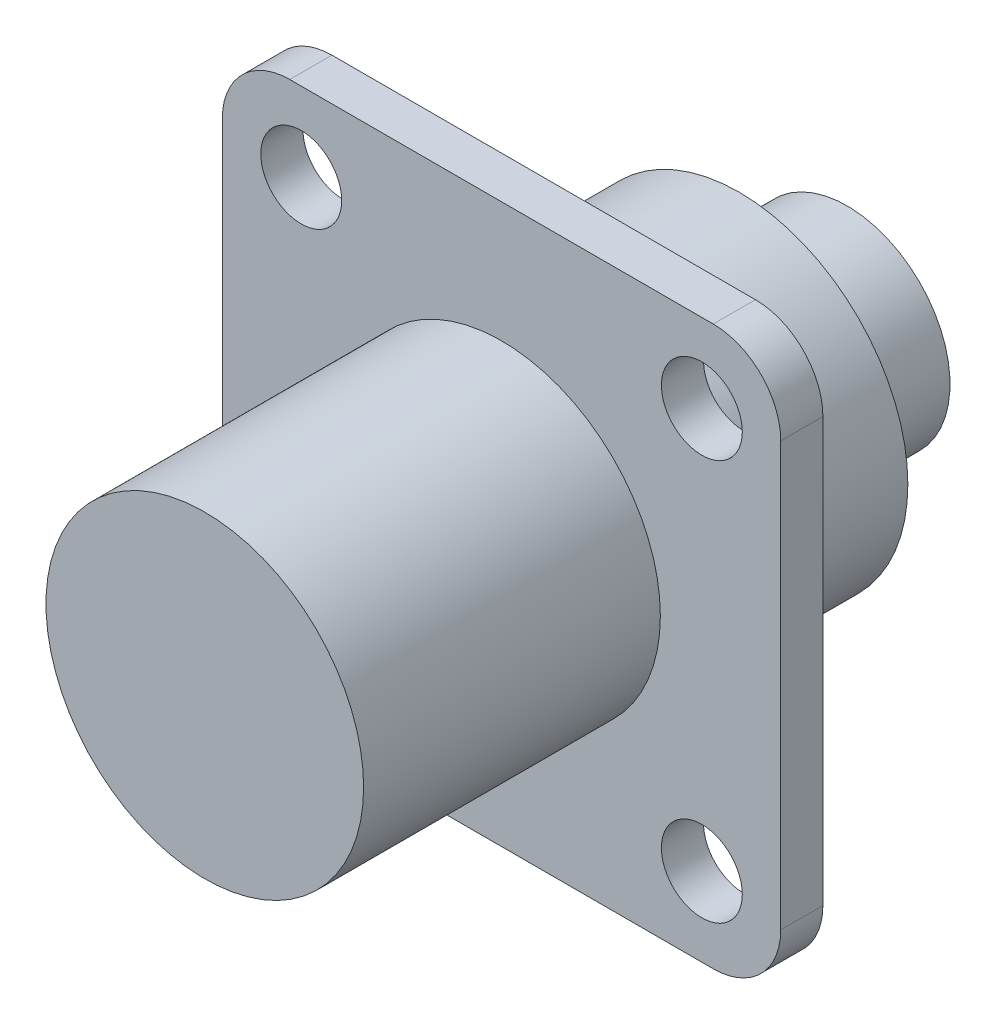
ISO-10303-21;
HEADER;
FILE_DESCRIPTION(('STEP AP214'),'2;1');
FILE_NAME('part.step','',(''),(''),'','','');
FILE_SCHEMA(('AUTOMOTIVE_DESIGN { 1 0 10303 214 1 1 1 1 }'));
ENDSEC;
DATA;
#1=APPLICATION_CONTEXT('core data for automotive mechanical design processes');
#2=APPLICATION_PROTOCOL_DEFINITION('international standard','automotive_design',2000,#1);
#3=PRODUCT_CONTEXT('',#1,'mechanical');
#4=PRODUCT('Part','Part','',(#3));
#5=PRODUCT_RELATED_PRODUCT_CATEGORY('part','',(#4));
#6=PRODUCT_DEFINITION_FORMATION('','',#4);
#7=PRODUCT_DEFINITION_CONTEXT('part definition',#1,'design');
#8=PRODUCT_DEFINITION('design','',#6,#7);
#9=PRODUCT_DEFINITION_SHAPE('','',#8);
#10=(LENGTH_UNIT() NAMED_UNIT(*) SI_UNIT(.MILLI.,.METRE.));
#11=(NAMED_UNIT(*) PLANE_ANGLE_UNIT() SI_UNIT($,.RADIAN.));
#12=(NAMED_UNIT(*) SI_UNIT($,.STERADIAN.) SOLID_ANGLE_UNIT());
#13=UNCERTAINTY_MEASURE_WITH_UNIT(LENGTH_MEASURE(1.E-05),#10,'distance_accuracy_value','');
#14=(GEOMETRIC_REPRESENTATION_CONTEXT(3) GLOBAL_UNCERTAINTY_ASSIGNED_CONTEXT((#13)) GLOBAL_UNIT_ASSIGNED_CONTEXT((#10,
#11,#12)) REPRESENTATION_CONTEXT('',''));
#15=CARTESIAN_POINT('',(0.,0.,0.));
#16=DIRECTION('',(0.,0.,1.));
#17=DIRECTION('',(1.,0.,0.));
#18=AXIS2_PLACEMENT_3D('',#15,#16,#17);
#19=CARTESIAN_POINT('',(10.5156,10.5156,1.5875));
#20=DIRECTION('',(-1.,0.,0.));
#21=DIRECTION('',(0.,-1.,0.));
#22=AXIS2_PLACEMENT_3D('',#19,#20,#21);
#23=PLANE('',#22);
#24=DIRECTION('',(0.,1.,0.));
#25=VECTOR('',#24,1.);
#26=CARTESIAN_POINT('',(10.5156,10.5156,0.));
#27=LINE('',#26,#25);
#28=CARTESIAN_POINT('',(10.5156,-7.9756,0.));
#29=VERTEX_POINT('',#28);
#30=CARTESIAN_POINT('',(10.5156,7.9756,0.));
#31=VERTEX_POINT('',#30);
#32=EDGE_CURVE('E131',#29,#31,#27,.T.);
#33=ORIENTED_EDGE('',*,*,#32,.T.);
#34=DIRECTION('',(0.,0.,-1.));
#35=VECTOR('',#34,1.);
#36=CARTESIAN_POINT('',(10.5156,7.9756,1.5875));
#37=LINE('',#36,#35);
#38=CARTESIAN_POINT('',(10.5156,7.9756,1.5875));
#39=VERTEX_POINT('',#38);
#40=EDGE_CURVE('E109',#31,#39,#37,.F.);
#41=ORIENTED_EDGE('',*,*,#40,.T.);
#42=DIRECTION('',(0.,1.,0.));
#43=VECTOR('',#42,1.);
#44=CARTESIAN_POINT('',(10.5156,10.5156,1.5875));
#45=LINE('',#44,#43);
#46=CARTESIAN_POINT('',(10.5156,-7.9756,1.5875));
#47=VERTEX_POINT('',#46);
#48=EDGE_CURVE('E141',#47,#39,#45,.T.);
#49=ORIENTED_EDGE('',*,*,#48,.F.);
#50=DIRECTION('',(0.,0.,-1.));
#51=VECTOR('',#50,1.);
#52=CARTESIAN_POINT('',(10.5156,-7.9756,1.5875));
#53=LINE('',#52,#51);
#54=EDGE_CURVE('E114',#47,#29,#53,.T.);
#55=ORIENTED_EDGE('',*,*,#54,.T.);
#56=EDGE_LOOP('',(#33,#41,#49,#55));
#57=FACE_BOUND('',#56,.T.);
#58=ADVANCED_FACE('F37',(#57),#23,.F.);
#59=CARTESIAN_POINT('',(-10.5156,10.5156,1.5875));
#60=DIRECTION('',(0.,-1.,0.));
#61=DIRECTION('',(0.,0.,-1.));
#62=AXIS2_PLACEMENT_3D('',#59,#60,#61);
#63=PLANE('',#62);
#64=DIRECTION('',(-1.,0.,0.));
#65=VECTOR('',#64,1.);
#66=CARTESIAN_POINT('',(-10.5156,10.5156,1.5875));
#67=LINE('',#66,#65);
#68=CARTESIAN_POINT('',(7.97559999999999,10.5156,1.5875));
#69=VERTEX_POINT('',#68);
#70=CARTESIAN_POINT('',(-7.9756,10.5156,1.5875));
#71=VERTEX_POINT('',#70);
#72=EDGE_CURVE('E124',#69,#71,#67,.T.);
#73=ORIENTED_EDGE('',*,*,#72,.F.);
#74=DIRECTION('',(0.,0.,-1.));
#75=VECTOR('',#74,1.);
#76=CARTESIAN_POINT('',(7.97559999999999,10.5156,1.5875));
#77=LINE('',#76,#75);
#78=CARTESIAN_POINT('',(7.97559999999999,10.5156,0.));
#79=VERTEX_POINT('',#78);
#80=EDGE_CURVE('E108',#69,#79,#77,.T.);
#81=ORIENTED_EDGE('',*,*,#80,.T.);
#82=DIRECTION('',(-1.,0.,0.));
#83=VECTOR('',#82,1.);
#84=CARTESIAN_POINT('',(-10.5156,10.5156,0.));
#85=LINE('',#84,#83);
#86=CARTESIAN_POINT('',(-7.9756,10.5156,0.));
#87=VERTEX_POINT('',#86);
#88=EDGE_CURVE('E121',#79,#87,#85,.T.);
#89=ORIENTED_EDGE('',*,*,#88,.T.);
#90=DIRECTION('',(0.,0.,-1.));
#91=VECTOR('',#90,1.);
#92=CARTESIAN_POINT('',(-7.9756,10.5156,1.5875));
#93=LINE('',#92,#91);
#94=EDGE_CURVE('E126',#87,#71,#93,.F.);
#95=ORIENTED_EDGE('',*,*,#94,.T.);
#96=EDGE_LOOP('',(#73,#81,#89,#95));
#97=FACE_BOUND('',#96,.T.);
#98=ADVANCED_FACE('F120',(#97),#63,.F.);
#99=CARTESIAN_POINT('',(-10.5156,10.5156,1.5875));
#100=DIRECTION('',(1.,0.,0.));
#101=DIRECTION('',(0.,1.,0.));
#102=AXIS2_PLACEMENT_3D('',#99,#100,#101);
#103=PLANE('',#102);
#104=DIRECTION('',(0.,-1.,0.));
#105=VECTOR('',#104,1.);
#106=CARTESIAN_POINT('',(-10.5156,10.5156,0.));
#107=LINE('',#106,#105);
#108=CARTESIAN_POINT('',(-10.5156,7.9756,0.));
#109=VERTEX_POINT('',#108);
#110=CARTESIAN_POINT('',(-10.5156,-7.9756,0.));
#111=VERTEX_POINT('',#110);
#112=EDGE_CURVE('E130',#109,#111,#107,.T.);
#113=ORIENTED_EDGE('',*,*,#112,.T.);
#114=DIRECTION('',(0.,0.,-1.));
#115=VECTOR('',#114,1.);
#116=CARTESIAN_POINT('',(-10.5156,-7.9756,1.5875));
#117=LINE('',#116,#115);
#118=CARTESIAN_POINT('',(-10.5156,-7.9756,1.5875));
#119=VERTEX_POINT('',#118);
#120=EDGE_CURVE('E45',#111,#119,#117,.F.);
#121=ORIENTED_EDGE('',*,*,#120,.T.);
#122=DIRECTION('',(0.,-1.,0.));
#123=VECTOR('',#122,1.);
#124=CARTESIAN_POINT('',(-10.5156,10.5156,1.5875));
#125=LINE('',#124,#123);
#126=CARTESIAN_POINT('',(-10.5156,7.9756,1.5875));
#127=VERTEX_POINT('',#126);
#128=EDGE_CURVE('E168',#127,#119,#125,.T.);
#129=ORIENTED_EDGE('',*,*,#128,.F.);
#130=DIRECTION('',(0.,0.,-1.));
#131=VECTOR('',#130,1.);
#132=CARTESIAN_POINT('',(-10.5156,7.9756,1.5875));
#133=LINE('',#132,#131);
#134=EDGE_CURVE('E162',#127,#109,#133,.T.);
#135=ORIENTED_EDGE('',*,*,#134,.T.);
#136=EDGE_LOOP('',(#113,#121,#129,#135));
#137=FACE_BOUND('',#136,.T.);
#138=ADVANCED_FACE('F167',(#137),#103,.F.);
#139=CARTESIAN_POINT('',(-10.5156,-10.5156,1.5875));
#140=DIRECTION('',(0.,1.,0.));
#141=DIRECTION('',(0.,0.,1.));
#142=AXIS2_PLACEMENT_3D('',#139,#140,#141);
#143=PLANE('',#142);
#144=DIRECTION('',(1.,0.,0.));
#145=VECTOR('',#144,1.);
#146=CARTESIAN_POINT('',(-10.5156,-10.5156,0.));
#147=LINE('',#146,#145);
#148=CARTESIAN_POINT('',(-7.9756,-10.5156,0.));
#149=VERTEX_POINT('',#148);
#150=CARTESIAN_POINT('',(7.9756,-10.5156,0.));
#151=VERTEX_POINT('',#150);
#152=EDGE_CURVE('E134',#149,#151,#147,.T.);
#153=ORIENTED_EDGE('',*,*,#152,.T.);
#154=DIRECTION('',(0.,0.,-1.));
#155=VECTOR('',#154,1.);
#156=CARTESIAN_POINT('',(7.9756,-10.5156,1.5875));
#157=LINE('',#156,#155);
#158=CARTESIAN_POINT('',(7.9756,-10.5156,1.5875));
#159=VERTEX_POINT('',#158);
#160=EDGE_CURVE('E52',#151,#159,#157,.F.);
#161=ORIENTED_EDGE('',*,*,#160,.T.);
#162=DIRECTION('',(1.,0.,0.));
#163=VECTOR('',#162,1.);
#164=CARTESIAN_POINT('',(-10.5156,-10.5156,1.5875));
#165=LINE('',#164,#163);
#166=CARTESIAN_POINT('',(-7.9756,-10.5156,1.5875));
#167=VERTEX_POINT('',#166);
#168=EDGE_CURVE('E142',#167,#159,#165,.T.);
#169=ORIENTED_EDGE('',*,*,#168,.F.);
#170=DIRECTION('',(0.,0.,-1.));
#171=VECTOR('',#170,1.);
#172=CARTESIAN_POINT('',(-7.9756,-10.5156,1.5875));
#173=LINE('',#172,#171);
#174=EDGE_CURVE('E158',#167,#149,#173,.T.);
#175=ORIENTED_EDGE('',*,*,#174,.T.);
#176=EDGE_LOOP('',(#153,#161,#169,#175));
#177=FACE_BOUND('',#176,.T.);
#178=ADVANCED_FACE('F178',(#177),#143,.F.);
#179=CARTESIAN_POINT('',(0.,0.,1.5875));
#180=DIRECTION('',(0.,0.,1.));
#181=DIRECTION('',(1.,0.,0.));
#182=AXIS2_PLACEMENT_3D('',#179,#180,#181);
#183=PLANE('',#182);
#184=CARTESIAN_POINT('',(0.,0.,1.5875));
#185=DIRECTION('',(0.,0.,1.));
#186=DIRECTION('',(1.,0.,0.));
#187=AXIS2_PLACEMENT_3D('',#184,#185,#186);
#188=CIRCLE('',#187,5.9817);
#189=CARTESIAN_POINT('',(5.9817,0.,1.5875));
#190=VERTEX_POINT('',#189);
#191=EDGE_CURVE('E212',#190,#190,#188,.T.);
#192=ORIENTED_EDGE('',*,*,#191,.F.);
#193=EDGE_LOOP('',(#192));
#194=FACE_BOUND('',#193,.T.);
#195=CARTESIAN_POINT('',(-7.5438,-7.5438,1.5875));
#196=DIRECTION('',(0.,0.,1.));
#197=DIRECTION('',(1.,0.,0.));
#198=AXIS2_PLACEMENT_3D('',#195,#196,#197);
#199=CIRCLE('',#198,1.524);
#200=CARTESIAN_POINT('',(-6.0198,-7.5438,1.5875));
#201=VERTEX_POINT('',#200);
#202=EDGE_CURVE('E207',#201,#201,#199,.T.);
#203=ORIENTED_EDGE('',*,*,#202,.F.);
#204=EDGE_LOOP('',(#203));
#205=FACE_BOUND('',#204,.T.);
#206=CARTESIAN_POINT('',(7.5438,-7.5438,1.5875));
#207=DIRECTION('',(0.,0.,1.));
#208=DIRECTION('',(1.,0.,0.));
#209=AXIS2_PLACEMENT_3D('',#206,#207,#208);
#210=CIRCLE('',#209,1.524);
#211=CARTESIAN_POINT('',(9.0678,-7.5438,1.5875));
#212=VERTEX_POINT('',#211);
#213=EDGE_CURVE('E201',#212,#212,#210,.T.);
#214=ORIENTED_EDGE('',*,*,#213,.F.);
#215=EDGE_LOOP('',(#214));
#216=FACE_BOUND('',#215,.T.);
#217=CARTESIAN_POINT('',(7.5438,7.5438,1.5875));
#218=DIRECTION('',(0.,0.,1.));
#219=DIRECTION('',(1.,0.,0.));
#220=AXIS2_PLACEMENT_3D('',#217,#218,#219);
#221=CIRCLE('',#220,1.524);
#222=CARTESIAN_POINT('',(9.0678,7.5438,1.5875));
#223=VERTEX_POINT('',#222);
#224=EDGE_CURVE('E194',#223,#223,#221,.T.);
#225=ORIENTED_EDGE('',*,*,#224,.F.);
#226=EDGE_LOOP('',(#225));
#227=FACE_BOUND('',#226,.T.);
#228=CARTESIAN_POINT('',(-7.5438,7.5438,1.5875));
#229=DIRECTION('',(0.,0.,1.));
#230=DIRECTION('',(1.,0.,0.));
#231=AXIS2_PLACEMENT_3D('',#228,#229,#230);
#232=CIRCLE('',#231,1.524);
#233=CARTESIAN_POINT('',(-6.0198,7.5438,1.5875));
#234=VERTEX_POINT('',#233);
#235=EDGE_CURVE('E188',#234,#234,#232,.T.);
#236=ORIENTED_EDGE('',*,*,#235,.F.);
#237=EDGE_LOOP('',(#236));
#238=FACE_BOUND('',#237,.T.);
#239=ORIENTED_EDGE('',*,*,#48,.T.);
#240=CARTESIAN_POINT('',(7.97559999999999,7.9756,1.5875));
#241=DIRECTION('',(0.,0.,1.));
#242=DIRECTION('',(1.,0.,0.));
#243=AXIS2_PLACEMENT_3D('',#240,#241,#242);
#244=CIRCLE('',#243,2.54);
#245=EDGE_CURVE('E156',#39,#69,#244,.T.);
#246=ORIENTED_EDGE('',*,*,#245,.T.);
#247=ORIENTED_EDGE('',*,*,#72,.T.);
#248=CARTESIAN_POINT('',(-7.9756,7.9756,1.5875));
#249=DIRECTION('',(0.,0.,1.));
#250=DIRECTION('',(1.,0.,0.));
#251=AXIS2_PLACEMENT_3D('',#248,#249,#250);
#252=CIRCLE('',#251,2.54);
#253=EDGE_CURVE('E151',#71,#127,#252,.T.);
#254=ORIENTED_EDGE('',*,*,#253,.T.);
#255=ORIENTED_EDGE('',*,*,#128,.T.);
#256=CARTESIAN_POINT('',(-7.9756,-7.9756,1.5875));
#257=DIRECTION('',(0.,0.,1.));
#258=DIRECTION('',(1.,0.,0.));
#259=AXIS2_PLACEMENT_3D('',#256,#257,#258);
#260=CIRCLE('',#259,2.54);
#261=EDGE_CURVE('E59',#119,#167,#260,.T.);
#262=ORIENTED_EDGE('',*,*,#261,.T.);
#263=ORIENTED_EDGE('',*,*,#168,.T.);
#264=CARTESIAN_POINT('',(7.9756,-7.9756,1.5875));
#265=DIRECTION('',(0.,0.,1.));
#266=DIRECTION('',(1.,0.,0.));
#267=AXIS2_PLACEMENT_3D('',#264,#265,#266);
#268=CIRCLE('',#267,2.54);
#269=EDGE_CURVE('E154',#159,#47,#268,.T.);
#270=ORIENTED_EDGE('',*,*,#269,.T.);
#271=EDGE_LOOP('',(#239,#246,#247,#254,#255,#262,#263,#270));
#272=FACE_BOUND('',#271,.T.);
#273=ADVANCED_FACE('F172',(#194,#205,#216,#227,#238,#272),#183,.T.);
#274=CARTESIAN_POINT('',(0.,0.,0.));
#275=DIRECTION('',(0.,0.,1.));
#276=DIRECTION('',(1.,0.,0.));
#277=AXIS2_PLACEMENT_3D('',#274,#275,#276);
#278=PLANE('',#277);
#279=CARTESIAN_POINT('',(0.,0.,0.));
#280=DIRECTION('',(0.,0.,1.));
#281=DIRECTION('',(1.,0.,0.));
#282=AXIS2_PLACEMENT_3D('',#279,#280,#281);
#283=CIRCLE('',#282,6.35);
#284=CARTESIAN_POINT('',(6.35,0.,0.));
#285=VERTEX_POINT('',#284);
#286=EDGE_CURVE('E11',#285,#285,#283,.F.);
#287=ORIENTED_EDGE('',*,*,#286,.F.);
#288=EDGE_LOOP('',(#287));
#289=FACE_BOUND('',#288,.T.);
#290=CARTESIAN_POINT('',(-7.5438,-7.5438,0.));
#291=DIRECTION('',(0.,0.,1.));
#292=DIRECTION('',(1.,0.,0.));
#293=AXIS2_PLACEMENT_3D('',#290,#291,#292);
#294=CIRCLE('',#293,1.524);
#295=CARTESIAN_POINT('',(-6.0198,-7.5438,0.));
#296=VERTEX_POINT('',#295);
#297=EDGE_CURVE('E191',#296,#296,#294,.T.);
#298=ORIENTED_EDGE('',*,*,#297,.T.);
#299=EDGE_LOOP('',(#298));
#300=FACE_BOUND('',#299,.T.);
#301=CARTESIAN_POINT('',(7.5438,-7.5438,0.));
#302=DIRECTION('',(0.,0.,1.));
#303=DIRECTION('',(1.,0.,0.));
#304=AXIS2_PLACEMENT_3D('',#301,#302,#303);
#305=CIRCLE('',#304,1.524);
#306=CARTESIAN_POINT('',(9.0678,-7.5438,0.));
#307=VERTEX_POINT('',#306);
#308=EDGE_CURVE('E204',#307,#307,#305,.T.);
#309=ORIENTED_EDGE('',*,*,#308,.T.);
#310=EDGE_LOOP('',(#309));
#311=FACE_BOUND('',#310,.T.);
#312=CARTESIAN_POINT('',(7.5438,7.5438,0.));
#313=DIRECTION('',(0.,0.,1.));
#314=DIRECTION('',(1.,0.,0.));
#315=AXIS2_PLACEMENT_3D('',#312,#313,#314);
#316=CIRCLE('',#315,1.524);
#317=CARTESIAN_POINT('',(9.0678,7.5438,0.));
#318=VERTEX_POINT('',#317);
#319=EDGE_CURVE('E197',#318,#318,#316,.T.);
#320=ORIENTED_EDGE('',*,*,#319,.T.);
#321=EDGE_LOOP('',(#320));
#322=FACE_BOUND('',#321,.T.);
#323=CARTESIAN_POINT('',(-7.5438,7.5438,0.));
#324=DIRECTION('',(0.,0.,1.));
#325=DIRECTION('',(1.,0.,0.));
#326=AXIS2_PLACEMENT_3D('',#323,#324,#325);
#327=CIRCLE('',#326,1.524);
#328=CARTESIAN_POINT('',(-6.0198,7.5438,0.));
#329=VERTEX_POINT('',#328);
#330=EDGE_CURVE('E136',#329,#329,#327,.T.);
#331=ORIENTED_EDGE('',*,*,#330,.T.);
#332=EDGE_LOOP('',(#331));
#333=FACE_BOUND('',#332,.T.);
#334=ORIENTED_EDGE('',*,*,#88,.F.);
#335=CARTESIAN_POINT('',(7.97559999999999,7.9756,0.));
#336=DIRECTION('',(0.,0.,1.));
#337=DIRECTION('',(1.,0.,0.));
#338=AXIS2_PLACEMENT_3D('',#335,#336,#337);
#339=CIRCLE('',#338,2.54);
#340=EDGE_CURVE('E104',#79,#31,#339,.F.);
#341=ORIENTED_EDGE('',*,*,#340,.T.);
#342=ORIENTED_EDGE('',*,*,#32,.F.);
#343=CARTESIAN_POINT('',(7.9756,-7.9756,0.));
#344=DIRECTION('',(0.,0.,1.));
#345=DIRECTION('',(1.,0.,0.));
#346=AXIS2_PLACEMENT_3D('',#343,#344,#345);
#347=CIRCLE('',#346,2.54);
#348=EDGE_CURVE('E115',#29,#151,#347,.F.);
#349=ORIENTED_EDGE('',*,*,#348,.T.);
#350=ORIENTED_EDGE('',*,*,#152,.F.);
#351=CARTESIAN_POINT('',(-7.9756,-7.9756,0.));
#352=DIRECTION('',(0.,0.,1.));
#353=DIRECTION('',(1.,0.,0.));
#354=AXIS2_PLACEMENT_3D('',#351,#352,#353);
#355=CIRCLE('',#354,2.54);
#356=EDGE_CURVE('E145',#149,#111,#355,.F.);
#357=ORIENTED_EDGE('',*,*,#356,.T.);
#358=ORIENTED_EDGE('',*,*,#112,.F.);
#359=CARTESIAN_POINT('',(-7.9756,7.9756,0.));
#360=DIRECTION('',(0.,0.,1.));
#361=DIRECTION('',(1.,0.,0.));
#362=AXIS2_PLACEMENT_3D('',#359,#360,#361);
#363=CIRCLE('',#362,2.54);
#364=EDGE_CURVE('E125',#109,#87,#363,.F.);
#365=ORIENTED_EDGE('',*,*,#364,.T.);
#366=EDGE_LOOP('',(#334,#341,#342,#349,#350,#357,#358,#365));
#367=FACE_BOUND('',#366,.T.);
#368=ADVANCED_FACE('F128',(#289,#300,#311,#322,#333,#367),#278,.F.);
#369=CARTESIAN_POINT('',(-7.5438,7.5438,0.));
#370=DIRECTION('',(0.,0.,1.));
#371=DIRECTION('',(1.,0.,0.));
#372=AXIS2_PLACEMENT_3D('',#369,#370,#371);
#373=CYLINDRICAL_SURFACE('',#372,1.524);
#374=ORIENTED_EDGE('',*,*,#330,.F.);
#375=EDGE_LOOP('',(#374));
#376=FACE_BOUND('',#375,.T.);
#377=ORIENTED_EDGE('',*,*,#235,.T.);
#378=EDGE_LOOP('',(#377));
#379=FACE_BOUND('',#378,.T.);
#380=ADVANCED_FACE('F250',(#376,#379),#373,.F.);
#381=CARTESIAN_POINT('',(7.5438,7.5438,0.));
#382=DIRECTION('',(0.,0.,1.));
#383=DIRECTION('',(1.,0.,0.));
#384=AXIS2_PLACEMENT_3D('',#381,#382,#383);
#385=CYLINDRICAL_SURFACE('',#384,1.524);
#386=ORIENTED_EDGE('',*,*,#319,.F.);
#387=EDGE_LOOP('',(#386));
#388=FACE_BOUND('',#387,.T.);
#389=ORIENTED_EDGE('',*,*,#224,.T.);
#390=EDGE_LOOP('',(#389));
#391=FACE_BOUND('',#390,.T.);
#392=ADVANCED_FACE('F262',(#388,#391),#385,.F.);
#393=CARTESIAN_POINT('',(7.5438,-7.5438,0.));
#394=DIRECTION('',(0.,0.,1.));
#395=DIRECTION('',(1.,0.,0.));
#396=AXIS2_PLACEMENT_3D('',#393,#394,#395);
#397=CYLINDRICAL_SURFACE('',#396,1.524);
#398=ORIENTED_EDGE('',*,*,#308,.F.);
#399=EDGE_LOOP('',(#398));
#400=FACE_BOUND('',#399,.T.);
#401=ORIENTED_EDGE('',*,*,#213,.T.);
#402=EDGE_LOOP('',(#401));
#403=FACE_BOUND('',#402,.T.);
#404=ADVANCED_FACE('F308',(#400,#403),#397,.F.);
#405=CARTESIAN_POINT('',(-7.5438,-7.5438,0.));
#406=DIRECTION('',(0.,0.,1.));
#407=DIRECTION('',(1.,0.,0.));
#408=AXIS2_PLACEMENT_3D('',#405,#406,#407);
#409=CYLINDRICAL_SURFACE('',#408,1.524);
#410=ORIENTED_EDGE('',*,*,#297,.F.);
#411=EDGE_LOOP('',(#410));
#412=FACE_BOUND('',#411,.T.);
#413=ORIENTED_EDGE('',*,*,#202,.T.);
#414=EDGE_LOOP('',(#413));
#415=FACE_BOUND('',#414,.T.);
#416=ADVANCED_FACE('F285',(#412,#415),#409,.F.);
#417=CARTESIAN_POINT('',(7.97559999999999,7.9756,1.5875));
#418=DIRECTION('',(0.,0.,-1.));
#419=DIRECTION('',(-1.,0.,0.));
#420=AXIS2_PLACEMENT_3D('',#417,#418,#419);
#421=CYLINDRICAL_SURFACE('',#420,2.54);
#422=ORIENTED_EDGE('',*,*,#245,.F.);
#423=ORIENTED_EDGE('',*,*,#40,.F.);
#424=ORIENTED_EDGE('',*,*,#340,.F.);
#425=ORIENTED_EDGE('',*,*,#80,.F.);
#426=EDGE_LOOP('',(#422,#423,#424,#425));
#427=FACE_BOUND('',#426,.T.);
#428=ADVANCED_FACE('F107',(#427),#421,.T.);
#429=CARTESIAN_POINT('',(7.9756,-7.9756,1.5875));
#430=DIRECTION('',(0.,0.,-1.));
#431=DIRECTION('',(-1.,0.,0.));
#432=AXIS2_PLACEMENT_3D('',#429,#430,#431);
#433=CYLINDRICAL_SURFACE('',#432,2.54);
#434=ORIENTED_EDGE('',*,*,#269,.F.);
#435=ORIENTED_EDGE('',*,*,#160,.F.);
#436=ORIENTED_EDGE('',*,*,#348,.F.);
#437=ORIENTED_EDGE('',*,*,#54,.F.);
#438=EDGE_LOOP('',(#434,#435,#436,#437));
#439=FACE_BOUND('',#438,.T.);
#440=ADVANCED_FACE('F182',(#439),#433,.T.);
#441=CARTESIAN_POINT('',(-7.9756,-7.9756,1.5875));
#442=DIRECTION('',(0.,0.,-1.));
#443=DIRECTION('',(-1.,0.,0.));
#444=AXIS2_PLACEMENT_3D('',#441,#442,#443);
#445=CYLINDRICAL_SURFACE('',#444,2.54);
#446=ORIENTED_EDGE('',*,*,#261,.F.);
#447=ORIENTED_EDGE('',*,*,#120,.F.);
#448=ORIENTED_EDGE('',*,*,#356,.F.);
#449=ORIENTED_EDGE('',*,*,#174,.F.);
#450=EDGE_LOOP('',(#446,#447,#448,#449));
#451=FACE_BOUND('',#450,.T.);
#452=ADVANCED_FACE('F176',(#451),#445,.T.);
#453=CARTESIAN_POINT('',(-7.9756,7.9756,1.5875));
#454=DIRECTION('',(0.,0.,-1.));
#455=DIRECTION('',(-1.,0.,0.));
#456=AXIS2_PLACEMENT_3D('',#453,#454,#455);
#457=CYLINDRICAL_SURFACE('',#456,2.54);
#458=ORIENTED_EDGE('',*,*,#253,.F.);
#459=ORIENTED_EDGE('',*,*,#94,.F.);
#460=ORIENTED_EDGE('',*,*,#364,.F.);
#461=ORIENTED_EDGE('',*,*,#134,.F.);
#462=EDGE_LOOP('',(#458,#459,#460,#461));
#463=FACE_BOUND('',#462,.T.);
#464=ADVANCED_FACE('F39',(#463),#457,.T.);
#465=CARTESIAN_POINT('',(0.,0.,12.7635));
#466=DIRECTION('',(0.,0.,-1.));
#467=DIRECTION('',(-1.,0.,0.));
#468=AXIS2_PLACEMENT_3D('',#465,#466,#467);
#469=CYLINDRICAL_SURFACE('',#468,5.9817);
#470=CARTESIAN_POINT('',(0.,0.,12.7635));
#471=DIRECTION('',(0.,0.,1.));
#472=DIRECTION('',(1.,0.,0.));
#473=AXIS2_PLACEMENT_3D('',#470,#471,#472);
#474=CIRCLE('',#473,5.9817);
#475=CARTESIAN_POINT('',(5.9817,0.,12.7635));
#476=VERTEX_POINT('',#475);
#477=EDGE_CURVE('E198',#476,#476,#474,.T.);
#478=ORIENTED_EDGE('',*,*,#477,.F.);
#479=EDGE_LOOP('',(#478));
#480=FACE_BOUND('',#479,.T.);
#481=ORIENTED_EDGE('',*,*,#191,.T.);
#482=EDGE_LOOP('',(#481));
#483=FACE_BOUND('',#482,.T.);
#484=ADVANCED_FACE('F291',(#480,#483),#469,.T.);
#485=CARTESIAN_POINT('',(0.,0.,12.7635));
#486=DIRECTION('',(0.,0.,1.));
#487=DIRECTION('',(1.,0.,0.));
#488=AXIS2_PLACEMENT_3D('',#485,#486,#487);
#489=PLANE('',#488);
#490=ORIENTED_EDGE('',*,*,#477,.T.);
#491=EDGE_LOOP('',(#490));
#492=FACE_BOUND('',#491,.T.);
#493=ADVANCED_FACE('F244',(#492),#489,.T.);
#494=CARTESIAN_POINT('',(0.,0.,-7.366));
#495=DIRECTION('',(0.,0.,1.));
#496=DIRECTION('',(1.,0.,0.));
#497=AXIS2_PLACEMENT_3D('',#494,#495,#496);
#498=CYLINDRICAL_SURFACE('',#497,6.35);
#499=CARTESIAN_POINT('',(0.,0.,-7.366));
#500=DIRECTION('',(0.,0.,-1.));
#501=DIRECTION('',(-1.,0.,0.));
#502=AXIS2_PLACEMENT_3D('',#499,#500,#501);
#503=CIRCLE('',#502,6.35);
#504=CARTESIAN_POINT('',(-6.35,0.,-7.366));
#505=VERTEX_POINT('',#504);
#506=EDGE_CURVE('E215',#505,#505,#503,.T.);
#507=ORIENTED_EDGE('',*,*,#506,.F.);
#508=EDGE_LOOP('',(#507));
#509=FACE_BOUND('',#508,.T.);
#510=ORIENTED_EDGE('',*,*,#286,.T.);
#511=EDGE_LOOP('',(#510));
#512=FACE_BOUND('',#511,.T.);
#513=ADVANCED_FACE('F238',(#509,#512),#498,.T.);
#514=CARTESIAN_POINT('',(0.,0.,-7.366));
#515=DIRECTION('',(0.,0.,-1.));
#516=DIRECTION('',(-1.,0.,0.));
#517=AXIS2_PLACEMENT_3D('',#514,#515,#516);
#518=PLANE('',#517);
#519=CARTESIAN_POINT('',(0.,0.,-7.366));
#520=DIRECTION('',(0.,0.,-1.));
#521=DIRECTION('',(-1.,0.,0.));
#522=AXIS2_PLACEMENT_3D('',#519,#520,#521);
#523=CIRCLE('',#522,3.8735);
#524=CARTESIAN_POINT('',(-3.8735,0.,-7.366));
#525=VERTEX_POINT('',#524);
#526=EDGE_CURVE('E221',#525,#525,#523,.T.);
#527=ORIENTED_EDGE('',*,*,#526,.F.);
#528=EDGE_LOOP('',(#527));
#529=FACE_BOUND('',#528,.T.);
#530=ORIENTED_EDGE('',*,*,#506,.T.);
#531=EDGE_LOOP('',(#530));
#532=FACE_BOUND('',#531,.T.);
#533=ADVANCED_FACE('F232',(#529,#532),#518,.T.);
#534=CARTESIAN_POINT('',(0.,0.,-11.43));
#535=DIRECTION('',(0.,0.,1.));
#536=DIRECTION('',(1.,0.,0.));
#537=AXIS2_PLACEMENT_3D('',#534,#535,#536);
#538=CYLINDRICAL_SURFACE('',#537,3.8735);
#539=CARTESIAN_POINT('',(0.,0.,-11.43));
#540=DIRECTION('',(0.,0.,-1.));
#541=DIRECTION('',(-1.,0.,0.));
#542=AXIS2_PLACEMENT_3D('',#539,#540,#541);
#543=CIRCLE('',#542,3.8735);
#544=CARTESIAN_POINT('',(-3.8735,0.,-11.43));
#545=VERTEX_POINT('',#544);
#546=EDGE_CURVE('E220',#545,#545,#543,.T.);
#547=ORIENTED_EDGE('',*,*,#546,.F.);
#548=EDGE_LOOP('',(#547));
#549=FACE_BOUND('',#548,.T.);
#550=ORIENTED_EDGE('',*,*,#526,.T.);
#551=EDGE_LOOP('',(#550));
#552=FACE_BOUND('',#551,.T.);
#553=ADVANCED_FACE('F229',(#549,#552),#538,.T.);
#554=CARTESIAN_POINT('',(0.,0.,-11.43));
#555=DIRECTION('',(0.,0.,-1.));
#556=DIRECTION('',(-1.,0.,0.));
#557=AXIS2_PLACEMENT_3D('',#554,#555,#556);
#558=PLANE('',#557);
#559=ORIENTED_EDGE('',*,*,#546,.T.);
#560=EDGE_LOOP('',(#559));
#561=FACE_BOUND('',#560,.T.);
#562=ADVANCED_FACE('F227',(#561),#558,.T.);
#563=CLOSED_SHELL('',(#58,#98,#138,#178,#273,#368,#380,#392,#404,#416,#428,#440,#452,#464,#484,
#493,#513,#533,#553,#562));
#564=MANIFOLD_SOLID_BREP('B2',#563);
#565=ADVANCED_BREP_SHAPE_REPRESENTATION('',(#18,#564),#14);
#566=SHAPE_DEFINITION_REPRESENTATION(#9,#565);
ENDSEC;
END-ISO-10303-21;
